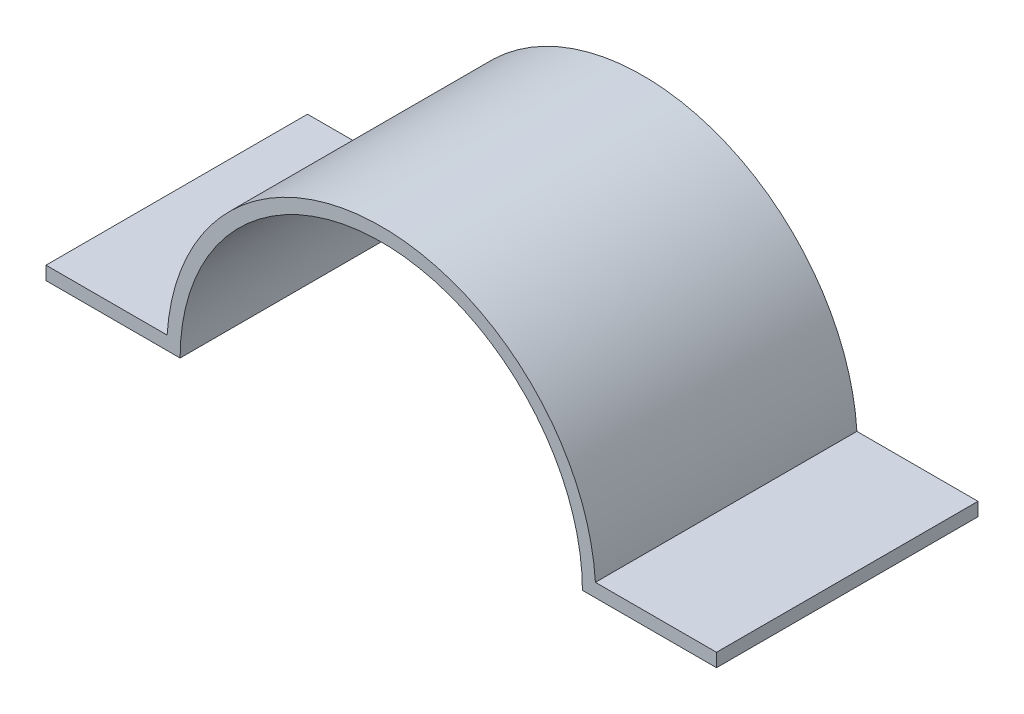
ISO-10303-21;
HEADER;
FILE_DESCRIPTION(('STEP AP214'),'2;1');
FILE_NAME('part.step','',(''),(''),'','','');
FILE_SCHEMA(('AUTOMOTIVE_DESIGN { 1 0 10303 214 1 1 1 1 }'));
ENDSEC;
DATA;
#1=APPLICATION_CONTEXT('core data for automotive mechanical design processes');
#2=APPLICATION_PROTOCOL_DEFINITION('international standard','automotive_design',2000,#1);
#3=PRODUCT_CONTEXT('',#1,'mechanical');
#4=PRODUCT('Part','Part','',(#3));
#5=PRODUCT_RELATED_PRODUCT_CATEGORY('part','',(#4));
#6=PRODUCT_DEFINITION_FORMATION('','',#4);
#7=PRODUCT_DEFINITION_CONTEXT('part definition',#1,'design');
#8=PRODUCT_DEFINITION('design','',#6,#7);
#9=PRODUCT_DEFINITION_SHAPE('','',#8);
#10=(LENGTH_UNIT() NAMED_UNIT(*) SI_UNIT(.MILLI.,.METRE.));
#11=(NAMED_UNIT(*) PLANE_ANGLE_UNIT() SI_UNIT($,.RADIAN.));
#12=(NAMED_UNIT(*) SI_UNIT($,.STERADIAN.) SOLID_ANGLE_UNIT());
#13=UNCERTAINTY_MEASURE_WITH_UNIT(LENGTH_MEASURE(1.E-05),#10,'distance_accuracy_value','');
#14=(GEOMETRIC_REPRESENTATION_CONTEXT(3) GLOBAL_UNCERTAINTY_ASSIGNED_CONTEXT((#13)) GLOBAL_UNIT_ASSIGNED_CONTEXT((#10,
#11,#12)) REPRESENTATION_CONTEXT('',''));
#15=CARTESIAN_POINT('',(0.,0.,0.));
#16=DIRECTION('',(0.,0.,1.));
#17=DIRECTION('',(1.,0.,0.));
#18=AXIS2_PLACEMENT_3D('',#15,#16,#17);
#19=CARTESIAN_POINT('',(0.,2.,39.));
#20=DIRECTION('',(0.,-1.,0.));
#21=DIRECTION('',(0.,0.,-1.));
#22=AXIS2_PLACEMENT_3D('',#19,#20,#21);
#23=PLANE('',#22);
#24=DIRECTION('',(1.,0.,0.));
#25=VECTOR('',#24,1.);
#26=CARTESIAN_POINT('',(0.,2.,0.));
#27=LINE('',#26,#25);
#28=CARTESIAN_POINT('',(18.0625611546574,2.,0.));
#29=VERTEX_POINT('',#28);
#30=CARTESIAN_POINT('',(0.,2.,0.));
#31=VERTEX_POINT('',#30);
#32=EDGE_CURVE('E142',#29,#31,#27,.F.);
#33=ORIENTED_EDGE('',*,*,#32,.T.);
#34=DIRECTION('',(0.,0.,-1.));
#35=VECTOR('',#34,1.);
#36=CARTESIAN_POINT('',(0.,2.,39.));
#37=LINE('',#36,#35);
#38=CARTESIAN_POINT('',(0.,2.,39.));
#39=VERTEX_POINT('',#38);
#40=EDGE_CURVE('E11',#39,#31,#37,.T.);
#41=ORIENTED_EDGE('',*,*,#40,.F.);
#42=DIRECTION('',(1.,0.,0.));
#43=VECTOR('',#42,1.);
#44=CARTESIAN_POINT('',(0.,2.,39.));
#45=LINE('',#44,#43);
#46=CARTESIAN_POINT('',(18.0625611546574,2.,39.));
#47=VERTEX_POINT('',#46);
#48=EDGE_CURVE('E95',#47,#39,#45,.F.);
#49=ORIENTED_EDGE('',*,*,#48,.F.);
#50=DIRECTION('',(0.,0.,-1.));
#51=VECTOR('',#50,1.);
#52=CARTESIAN_POINT('',(18.0625611546574,2.,39.));
#53=LINE('',#52,#51);
#54=EDGE_CURVE('E141',#47,#29,#53,.T.);
#55=ORIENTED_EDGE('',*,*,#54,.T.);
#56=EDGE_LOOP('',(#33,#41,#49,#55));
#57=FACE_BOUND('',#56,.T.);
#58=ADVANCED_FACE('F39',(#57),#23,.F.);
#59=CARTESIAN_POINT('',(0.,0.,39.));
#60=DIRECTION('',(-1.,0.,0.));
#61=DIRECTION('',(0.,0.,1.));
#62=AXIS2_PLACEMENT_3D('',#59,#60,#61);
#63=PLANE('',#62);
#64=DIRECTION('',(0.,1.,0.));
#65=VECTOR('',#64,1.);
#66=CARTESIAN_POINT('',(0.,0.,0.));
#67=LINE('',#66,#65);
#68=CARTESIAN_POINT('',(0.,0.,0.));
#69=VERTEX_POINT('',#68);
#70=EDGE_CURVE('E146',#69,#31,#67,.T.);
#71=ORIENTED_EDGE('',*,*,#70,.F.);
#72=DIRECTION('',(0.,0.,-1.));
#73=VECTOR('',#72,1.);
#74=CARTESIAN_POINT('',(0.,0.,39.));
#75=LINE('',#74,#73);
#76=CARTESIAN_POINT('',(0.,0.,39.));
#77=VERTEX_POINT('',#76);
#78=EDGE_CURVE('E48',#77,#69,#75,.T.);
#79=ORIENTED_EDGE('',*,*,#78,.F.);
#80=DIRECTION('',(0.,1.,0.));
#81=VECTOR('',#80,1.);
#82=CARTESIAN_POINT('',(0.,0.,39.));
#83=LINE('',#82,#81);
#84=EDGE_CURVE('E198',#77,#39,#83,.T.);
#85=ORIENTED_EDGE('',*,*,#84,.T.);
#86=ORIENTED_EDGE('',*,*,#40,.T.);
#87=EDGE_LOOP('',(#71,#79,#85,#86));
#88=FACE_BOUND('',#87,.T.);
#89=ADVANCED_FACE('F189',(#88),#63,.T.);
#90=CARTESIAN_POINT('',(0.,0.,39.));
#91=DIRECTION('',(0.,-1.,0.));
#92=DIRECTION('',(0.,0.,-1.));
#93=AXIS2_PLACEMENT_3D('',#90,#91,#92);
#94=PLANE('',#93);
#95=DIRECTION('',(-1.,0.,0.));
#96=VECTOR('',#95,1.);
#97=CARTESIAN_POINT('',(0.,0.,0.));
#98=LINE('',#97,#96);
#99=CARTESIAN_POINT('',(20.,0.,0.));
#100=VERTEX_POINT('',#99);
#101=EDGE_CURVE('E150',#100,#69,#98,.T.);
#102=ORIENTED_EDGE('',*,*,#101,.F.);
#103=DIRECTION('',(0.,0.,-1.));
#104=VECTOR('',#103,1.);
#105=CARTESIAN_POINT('',(20.,0.,39.));
#106=LINE('',#105,#104);
#107=CARTESIAN_POINT('',(20.,0.,39.));
#108=VERTEX_POINT('',#107);
#109=EDGE_CURVE('E177',#108,#100,#106,.T.);
#110=ORIENTED_EDGE('',*,*,#109,.F.);
#111=DIRECTION('',(-1.,0.,0.));
#112=VECTOR('',#111,1.);
#113=CARTESIAN_POINT('',(0.,0.,39.));
#114=LINE('',#113,#112);
#115=EDGE_CURVE('E186',#108,#77,#114,.T.);
#116=ORIENTED_EDGE('',*,*,#115,.T.);
#117=ORIENTED_EDGE('',*,*,#78,.T.);
#118=EDGE_LOOP('',(#102,#110,#116,#117));
#119=FACE_BOUND('',#118,.T.);
#120=ADVANCED_FACE('F184',(#119),#94,.T.);
#121=CARTESIAN_POINT('',(50.,0.,39.));
#122=DIRECTION('',(0.,0.,-1.));
#123=DIRECTION('',(-1.,0.,0.));
#124=AXIS2_PLACEMENT_3D('',#121,#122,#123);
#125=CYLINDRICAL_SURFACE('',#124,30.);
#126=CARTESIAN_POINT('',(50.,0.,0.));
#127=DIRECTION('',(0.,0.,1.));
#128=DIRECTION('',(-1.,0.,0.));
#129=AXIS2_PLACEMENT_3D('',#126,#127,#128);
#130=CIRCLE('',#129,30.);
#131=CARTESIAN_POINT('',(80.,0.,0.));
#132=VERTEX_POINT('',#131);
#133=EDGE_CURVE('E154',#132,#100,#130,.T.);
#134=ORIENTED_EDGE('',*,*,#133,.F.);
#135=DIRECTION('',(0.,0.,-1.));
#136=VECTOR('',#135,1.);
#137=CARTESIAN_POINT('',(80.,0.,39.));
#138=LINE('',#137,#136);
#139=CARTESIAN_POINT('',(80.,0.,39.));
#140=VERTEX_POINT('',#139);
#141=EDGE_CURVE('E174',#140,#132,#138,.T.);
#142=ORIENTED_EDGE('',*,*,#141,.F.);
#143=CARTESIAN_POINT('',(50.,0.,39.));
#144=DIRECTION('',(0.,0.,1.));
#145=DIRECTION('',(-1.,0.,0.));
#146=AXIS2_PLACEMENT_3D('',#143,#144,#145);
#147=CIRCLE('',#146,30.);
#148=EDGE_CURVE('E135',#140,#108,#147,.T.);
#149=ORIENTED_EDGE('',*,*,#148,.T.);
#150=ORIENTED_EDGE('',*,*,#109,.T.);
#151=EDGE_LOOP('',(#134,#142,#149,#150));
#152=FACE_BOUND('',#151,.T.);
#153=ADVANCED_FACE('F196',(#152),#125,.F.);
#154=CARTESIAN_POINT('',(100.,0.,39.));
#155=DIRECTION('',(0.,-1.,0.));
#156=DIRECTION('',(1.,0.,0.));
#157=AXIS2_PLACEMENT_3D('',#154,#155,#156);
#158=PLANE('',#157);
#159=DIRECTION('',(-1.,0.,0.));
#160=VECTOR('',#159,1.);
#161=CARTESIAN_POINT('',(100.,0.,0.));
#162=LINE('',#161,#160);
#163=CARTESIAN_POINT('',(100.,0.,0.));
#164=VERTEX_POINT('',#163);
#165=EDGE_CURVE('E158',#164,#132,#162,.T.);
#166=ORIENTED_EDGE('',*,*,#165,.F.);
#167=DIRECTION('',(0.,0.,-1.));
#168=VECTOR('',#167,1.);
#169=CARTESIAN_POINT('',(100.,0.,39.));
#170=LINE('',#169,#168);
#171=CARTESIAN_POINT('',(100.,0.,39.));
#172=VERTEX_POINT('',#171);
#173=EDGE_CURVE('E120',#172,#164,#170,.T.);
#174=ORIENTED_EDGE('',*,*,#173,.F.);
#175=DIRECTION('',(-1.,0.,0.));
#176=VECTOR('',#175,1.);
#177=CARTESIAN_POINT('',(100.,0.,39.));
#178=LINE('',#177,#176);
#179=EDGE_CURVE('E131',#172,#140,#178,.T.);
#180=ORIENTED_EDGE('',*,*,#179,.T.);
#181=ORIENTED_EDGE('',*,*,#141,.T.);
#182=EDGE_LOOP('',(#166,#174,#180,#181));
#183=FACE_BOUND('',#182,.T.);
#184=ADVANCED_FACE('F207',(#183),#158,.T.);
#185=CARTESIAN_POINT('',(100.,2.,39.));
#186=DIRECTION('',(1.,0.,0.));
#187=DIRECTION('',(0.,0.,-1.));
#188=AXIS2_PLACEMENT_3D('',#185,#186,#187);
#189=PLANE('',#188);
#190=DIRECTION('',(0.,-1.,0.));
#191=VECTOR('',#190,1.);
#192=CARTESIAN_POINT('',(100.,2.,0.));
#193=LINE('',#192,#191);
#194=CARTESIAN_POINT('',(100.,2.,0.));
#195=VERTEX_POINT('',#194);
#196=EDGE_CURVE('E118',#195,#164,#193,.T.);
#197=ORIENTED_EDGE('',*,*,#196,.F.);
#198=DIRECTION('',(0.,0.,-1.));
#199=VECTOR('',#198,1.);
#200=CARTESIAN_POINT('',(100.,2.,39.));
#201=LINE('',#200,#199);
#202=CARTESIAN_POINT('',(100.,2.,39.));
#203=VERTEX_POINT('',#202);
#204=EDGE_CURVE('E112',#203,#195,#201,.T.);
#205=ORIENTED_EDGE('',*,*,#204,.F.);
#206=DIRECTION('',(0.,-1.,0.));
#207=VECTOR('',#206,1.);
#208=CARTESIAN_POINT('',(100.,2.,39.));
#209=LINE('',#208,#207);
#210=EDGE_CURVE('E116',#203,#172,#209,.T.);
#211=ORIENTED_EDGE('',*,*,#210,.T.);
#212=ORIENTED_EDGE('',*,*,#173,.T.);
#213=EDGE_LOOP('',(#197,#205,#211,#212));
#214=FACE_BOUND('',#213,.T.);
#215=ADVANCED_FACE('F114',(#214),#189,.T.);
#216=CARTESIAN_POINT('',(100.,2.,39.));
#217=DIRECTION('',(0.,-1.,0.));
#218=DIRECTION('',(1.,0.,0.));
#219=AXIS2_PLACEMENT_3D('',#216,#217,#218);
#220=PLANE('',#219);
#221=DIRECTION('',(-1.,0.,0.));
#222=VECTOR('',#221,1.);
#223=CARTESIAN_POINT('',(100.,2.,0.));
#224=LINE('',#223,#222);
#225=CARTESIAN_POINT('',(81.9374388453426,2.,0.));
#226=VERTEX_POINT('',#225);
#227=EDGE_CURVE('E83',#195,#226,#224,.T.);
#228=ORIENTED_EDGE('',*,*,#227,.T.);
#229=DIRECTION('',(0.,0.,-1.));
#230=VECTOR('',#229,1.);
#231=CARTESIAN_POINT('',(81.9374388453426,2.,39.));
#232=LINE('',#231,#230);
#233=CARTESIAN_POINT('',(81.9374388453426,2.,39.));
#234=VERTEX_POINT('',#233);
#235=EDGE_CURVE('E121',#234,#226,#232,.T.);
#236=ORIENTED_EDGE('',*,*,#235,.F.);
#237=DIRECTION('',(-1.,0.,0.));
#238=VECTOR('',#237,1.);
#239=CARTESIAN_POINT('',(100.,2.,39.));
#240=LINE('',#239,#238);
#241=EDGE_CURVE('E123',#203,#234,#240,.T.);
#242=ORIENTED_EDGE('',*,*,#241,.F.);
#243=ORIENTED_EDGE('',*,*,#204,.T.);
#244=EDGE_LOOP('',(#228,#236,#242,#243));
#245=FACE_BOUND('',#244,.T.);
#246=ADVANCED_FACE('F124',(#245),#220,.F.);
#247=CARTESIAN_POINT('',(50.,0.,39.));
#248=DIRECTION('',(0.,0.,-1.));
#249=DIRECTION('',(-1.,0.,0.));
#250=AXIS2_PLACEMENT_3D('',#247,#248,#249);
#251=CYLINDRICAL_SURFACE('',#250,32.);
#252=CARTESIAN_POINT('',(50.,0.,0.));
#253=DIRECTION('',(0.,0.,1.));
#254=DIRECTION('',(1.,0.,0.));
#255=AXIS2_PLACEMENT_3D('',#252,#253,#254);
#256=CIRCLE('',#255,32.);
#257=EDGE_CURVE('E89',#226,#29,#256,.T.);
#258=ORIENTED_EDGE('',*,*,#257,.T.);
#259=ORIENTED_EDGE('',*,*,#54,.F.);
#260=CARTESIAN_POINT('',(50.,0.,39.));
#261=DIRECTION('',(0.,0.,1.));
#262=DIRECTION('',(1.,0.,0.));
#263=AXIS2_PLACEMENT_3D('',#260,#261,#262);
#264=CIRCLE('',#263,32.);
#265=EDGE_CURVE('E56',#234,#47,#264,.T.);
#266=ORIENTED_EDGE('',*,*,#265,.F.);
#267=ORIENTED_EDGE('',*,*,#235,.T.);
#268=EDGE_LOOP('',(#258,#259,#266,#267));
#269=FACE_BOUND('',#268,.T.);
#270=ADVANCED_FACE('F209',(#269),#251,.T.);
#271=CARTESIAN_POINT('',(50.,0.,39.));
#272=DIRECTION('',(0.,0.,1.));
#273=DIRECTION('',(1.,0.,0.));
#274=AXIS2_PLACEMENT_3D('',#271,#272,#273);
#275=PLANE('',#274);
#276=ORIENTED_EDGE('',*,*,#48,.T.);
#277=ORIENTED_EDGE('',*,*,#84,.F.);
#278=ORIENTED_EDGE('',*,*,#115,.F.);
#279=ORIENTED_EDGE('',*,*,#148,.F.);
#280=ORIENTED_EDGE('',*,*,#179,.F.);
#281=ORIENTED_EDGE('',*,*,#210,.F.);
#282=ORIENTED_EDGE('',*,*,#241,.T.);
#283=ORIENTED_EDGE('',*,*,#265,.T.);
#284=EDGE_LOOP('',(#276,#277,#278,#279,#280,#281,#282,#283));
#285=FACE_BOUND('',#284,.T.);
#286=ADVANCED_FACE('F128',(#285),#275,.T.);
#287=CARTESIAN_POINT('',(50.,0.,0.));
#288=DIRECTION('',(0.,0.,1.));
#289=DIRECTION('',(1.,0.,0.));
#290=AXIS2_PLACEMENT_3D('',#287,#288,#289);
#291=PLANE('',#290);
#292=ORIENTED_EDGE('',*,*,#32,.F.);
#293=ORIENTED_EDGE('',*,*,#257,.F.);
#294=ORIENTED_EDGE('',*,*,#227,.F.);
#295=ORIENTED_EDGE('',*,*,#196,.T.);
#296=ORIENTED_EDGE('',*,*,#165,.T.);
#297=ORIENTED_EDGE('',*,*,#133,.T.);
#298=ORIENTED_EDGE('',*,*,#101,.T.);
#299=ORIENTED_EDGE('',*,*,#70,.T.);
#300=EDGE_LOOP('',(#292,#293,#294,#295,#296,#297,#298,#299));
#301=FACE_BOUND('',#300,.T.);
#302=ADVANCED_FACE('F192',(#301),#291,.F.);
#303=CLOSED_SHELL('',(#58,#89,#120,#153,#184,#215,#246,#270,#286,#302));
#304=MANIFOLD_SOLID_BREP('B2',#303);
#305=ADVANCED_BREP_SHAPE_REPRESENTATION('',(#18,#304),#14);
#306=SHAPE_DEFINITION_REPRESENTATION(#9,#305);
ENDSEC;
END-ISO-10303-21;
